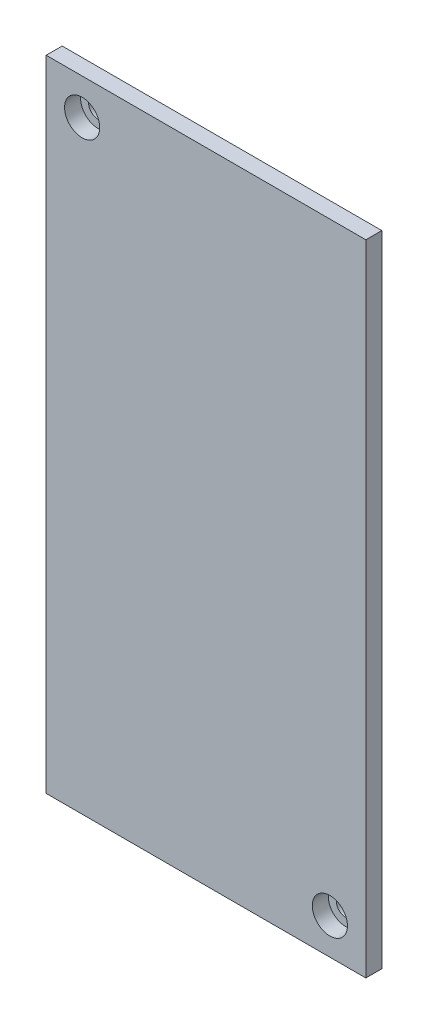
ISO-10303-21;
HEADER;
FILE_DESCRIPTION(('STEP AP214'),'2;1');
FILE_NAME('part.step','',(''),(''),'','','');
FILE_SCHEMA(('AUTOMOTIVE_DESIGN { 1 0 10303 214 1 1 1 1 }'));
ENDSEC;
DATA;
#1=APPLICATION_CONTEXT('core data for automotive mechanical design processes');
#2=APPLICATION_PROTOCOL_DEFINITION('international standard','automotive_design',2000,#1);
#3=PRODUCT_CONTEXT('',#1,'mechanical');
#4=PRODUCT('Part','Part','',(#3));
#5=PRODUCT_RELATED_PRODUCT_CATEGORY('part','',(#4));
#6=PRODUCT_DEFINITION_FORMATION('','',#4);
#7=PRODUCT_DEFINITION_CONTEXT('part definition',#1,'design');
#8=PRODUCT_DEFINITION('design','',#6,#7);
#9=PRODUCT_DEFINITION_SHAPE('','',#8);
#10=(LENGTH_UNIT() NAMED_UNIT(*) SI_UNIT(.MILLI.,.METRE.));
#11=(NAMED_UNIT(*) PLANE_ANGLE_UNIT() SI_UNIT($,.RADIAN.));
#12=(NAMED_UNIT(*) SI_UNIT($,.STERADIAN.) SOLID_ANGLE_UNIT());
#13=UNCERTAINTY_MEASURE_WITH_UNIT(LENGTH_MEASURE(1.E-05),#10,'distance_accuracy_value','');
#14=(GEOMETRIC_REPRESENTATION_CONTEXT(3) GLOBAL_UNCERTAINTY_ASSIGNED_CONTEXT((#13)) GLOBAL_UNIT_ASSIGNED_CONTEXT((#10,
#11,#12)) REPRESENTATION_CONTEXT('',''));
#15=CARTESIAN_POINT('',(0.,0.,0.));
#16=DIRECTION('',(0.,0.,1.));
#17=DIRECTION('',(1.,0.,0.));
#18=AXIS2_PLACEMENT_3D('',#15,#16,#17);
#19=CARTESIAN_POINT('',(15.5,-35.5,-1.));
#20=DIRECTION('',(0.,0.,1.));
#21=DIRECTION('',(1.,0.,0.));
#22=AXIS2_PLACEMENT_3D('',#19,#20,#21);
#23=CYLINDRICAL_SURFACE('',#22,1.2);
#24=CARTESIAN_POINT('',(15.5,-35.5,-1.));
#25=DIRECTION('',(0.,0.,1.));
#26=DIRECTION('',(1.,0.,0.));
#27=AXIS2_PLACEMENT_3D('',#24,#25,#26);
#28=CIRCLE('',#27,1.2);
#29=CARTESIAN_POINT('',(16.7,-35.5,-1.));
#30=VERTEX_POINT('',#29);
#31=EDGE_CURVE('E122',#30,#30,#28,.T.);
#32=ORIENTED_EDGE('',*,*,#31,.F.);
#33=EDGE_LOOP('',(#32));
#34=FACE_BOUND('',#33,.T.);
#35=CARTESIAN_POINT('',(15.5,-35.5,0.));
#36=DIRECTION('',(0.,0.,1.));
#37=DIRECTION('',(1.,0.,0.));
#38=AXIS2_PLACEMENT_3D('',#35,#36,#37);
#39=CIRCLE('',#38,1.2);
#40=CARTESIAN_POINT('',(16.7,-35.5,0.));
#41=VERTEX_POINT('',#40);
#42=EDGE_CURVE('E297',#41,#41,#39,.T.);
#43=ORIENTED_EDGE('',*,*,#42,.T.);
#44=EDGE_LOOP('',(#43));
#45=FACE_BOUND('',#44,.T.);
#46=ADVANCED_FACE('F33',(#34,#45),#23,.F.);
#47=CARTESIAN_POINT('',(-15.5,35.5,-1.));
#48=DIRECTION('',(0.,0.,1.));
#49=DIRECTION('',(1.,0.,0.));
#50=AXIS2_PLACEMENT_3D('',#47,#48,#49);
#51=CYLINDRICAL_SURFACE('',#50,1.2);
#52=CARTESIAN_POINT('',(-15.5,35.5,-1.));
#53=DIRECTION('',(0.,0.,1.));
#54=DIRECTION('',(1.,0.,0.));
#55=AXIS2_PLACEMENT_3D('',#52,#53,#54);
#56=CIRCLE('',#55,1.2);
#57=CARTESIAN_POINT('',(-14.3,35.5,-1.));
#58=VERTEX_POINT('',#57);
#59=EDGE_CURVE('E128',#58,#58,#56,.T.);
#60=ORIENTED_EDGE('',*,*,#59,.F.);
#61=EDGE_LOOP('',(#60));
#62=FACE_BOUND('',#61,.T.);
#63=CARTESIAN_POINT('',(-15.5,35.5,0.));
#64=DIRECTION('',(0.,0.,1.));
#65=DIRECTION('',(1.,0.,0.));
#66=AXIS2_PLACEMENT_3D('',#63,#64,#65);
#67=CIRCLE('',#66,1.2);
#68=CARTESIAN_POINT('',(-14.3,35.5,0.));
#69=VERTEX_POINT('',#68);
#70=EDGE_CURVE('E301',#69,#69,#67,.T.);
#71=ORIENTED_EDGE('',*,*,#70,.T.);
#72=EDGE_LOOP('',(#71));
#73=FACE_BOUND('',#72,.T.);
#74=ADVANCED_FACE('F198',(#62,#73),#51,.F.);
#75=CARTESIAN_POINT('',(20.,0.,2.));
#76=DIRECTION('',(1.,0.,0.));
#77=DIRECTION('',(0.,0.,-1.));
#78=AXIS2_PLACEMENT_3D('',#75,#76,#77);
#79=PLANE('',#78);
#80=DIRECTION('',(0.,-1.,0.));
#81=VECTOR('',#80,1.);
#82=CARTESIAN_POINT('',(20.,0.,0.));
#83=LINE('',#82,#81);
#84=CARTESIAN_POINT('',(20.,40.,0.));
#85=VERTEX_POINT('',#84);
#86=CARTESIAN_POINT('',(20.,-40.,0.));
#87=VERTEX_POINT('',#86);
#88=EDGE_CURVE('E133',#85,#87,#83,.T.);
#89=ORIENTED_EDGE('',*,*,#88,.F.);
#90=DIRECTION('',(0.,0.,-1.));
#91=VECTOR('',#90,1.);
#92=CARTESIAN_POINT('',(20.,40.,2.));
#93=LINE('',#92,#91);
#94=CARTESIAN_POINT('',(20.,40.,2.));
#95=VERTEX_POINT('',#94);
#96=EDGE_CURVE('E11',#95,#85,#93,.T.);
#97=ORIENTED_EDGE('',*,*,#96,.F.);
#98=DIRECTION('',(0.,-1.,0.));
#99=VECTOR('',#98,1.);
#100=CARTESIAN_POINT('',(20.,0.,2.));
#101=LINE('',#100,#99);
#102=CARTESIAN_POINT('',(20.,-40.,2.));
#103=VERTEX_POINT('',#102);
#104=EDGE_CURVE('E138',#95,#103,#101,.T.);
#105=ORIENTED_EDGE('',*,*,#104,.T.);
#106=DIRECTION('',(0.,0.,-1.));
#107=VECTOR('',#106,1.);
#108=CARTESIAN_POINT('',(20.,-40.,2.));
#109=LINE('',#108,#107);
#110=EDGE_CURVE('E149',#103,#87,#109,.T.);
#111=ORIENTED_EDGE('',*,*,#110,.T.);
#112=EDGE_LOOP('',(#89,#97,#105,#111));
#113=FACE_BOUND('',#112,.T.);
#114=ADVANCED_FACE('F35',(#113),#79,.T.);
#115=CARTESIAN_POINT('',(0.,40.,2.));
#116=DIRECTION('',(0.,1.,0.));
#117=DIRECTION('',(0.,0.,1.));
#118=AXIS2_PLACEMENT_3D('',#115,#116,#117);
#119=PLANE('',#118);
#120=DIRECTION('',(1.,0.,0.));
#121=VECTOR('',#120,1.);
#122=CARTESIAN_POINT('',(0.,40.,0.));
#123=LINE('',#122,#121);
#124=CARTESIAN_POINT('',(-20.,40.,0.));
#125=VERTEX_POINT('',#124);
#126=EDGE_CURVE('E152',#125,#85,#123,.T.);
#127=ORIENTED_EDGE('',*,*,#126,.F.);
#128=DIRECTION('',(0.,0.,-1.));
#129=VECTOR('',#128,1.);
#130=CARTESIAN_POINT('',(-20.,40.,2.));
#131=LINE('',#130,#129);
#132=CARTESIAN_POINT('',(-20.,40.,2.));
#133=VERTEX_POINT('',#132);
#134=EDGE_CURVE('E41',#133,#125,#131,.T.);
#135=ORIENTED_EDGE('',*,*,#134,.F.);
#136=DIRECTION('',(1.,0.,0.));
#137=VECTOR('',#136,1.);
#138=CARTESIAN_POINT('',(0.,40.,2.));
#139=LINE('',#138,#137);
#140=EDGE_CURVE('E141',#133,#95,#139,.T.);
#141=ORIENTED_EDGE('',*,*,#140,.T.);
#142=ORIENTED_EDGE('',*,*,#96,.T.);
#143=EDGE_LOOP('',(#127,#135,#141,#142));
#144=FACE_BOUND('',#143,.T.);
#145=ADVANCED_FACE('F173',(#144),#119,.T.);
#146=CARTESIAN_POINT('',(-20.,0.,2.));
#147=DIRECTION('',(1.,0.,0.));
#148=DIRECTION('',(0.,0.,-1.));
#149=AXIS2_PLACEMENT_3D('',#146,#147,#148);
#150=PLANE('',#149);
#151=DIRECTION('',(0.,-1.,0.));
#152=VECTOR('',#151,1.);
#153=CARTESIAN_POINT('',(-20.,0.,0.));
#154=LINE('',#153,#152);
#155=CARTESIAN_POINT('',(-20.,-40.,0.));
#156=VERTEX_POINT('',#155);
#157=EDGE_CURVE('E155',#125,#156,#154,.T.);
#158=ORIENTED_EDGE('',*,*,#157,.T.);
#159=DIRECTION('',(0.,0.,-1.));
#160=VECTOR('',#159,1.);
#161=CARTESIAN_POINT('',(-20.,-40.,2.));
#162=LINE('',#161,#160);
#163=CARTESIAN_POINT('',(-20.,-40.,2.));
#164=VERTEX_POINT('',#163);
#165=EDGE_CURVE('E160',#164,#156,#162,.T.);
#166=ORIENTED_EDGE('',*,*,#165,.F.);
#167=DIRECTION('',(0.,-1.,0.));
#168=VECTOR('',#167,1.);
#169=CARTESIAN_POINT('',(-20.,0.,2.));
#170=LINE('',#169,#168);
#171=EDGE_CURVE('E145',#133,#164,#170,.T.);
#172=ORIENTED_EDGE('',*,*,#171,.F.);
#173=ORIENTED_EDGE('',*,*,#134,.T.);
#174=EDGE_LOOP('',(#158,#166,#172,#173));
#175=FACE_BOUND('',#174,.T.);
#176=ADVANCED_FACE('F165',(#175),#150,.F.);
#177=CARTESIAN_POINT('',(0.,-40.,2.));
#178=DIRECTION('',(0.,1.,0.));
#179=DIRECTION('',(0.,0.,1.));
#180=AXIS2_PLACEMENT_3D('',#177,#178,#179);
#181=PLANE('',#180);
#182=DIRECTION('',(1.,0.,0.));
#183=VECTOR('',#182,1.);
#184=CARTESIAN_POINT('',(0.,-40.,0.));
#185=LINE('',#184,#183);
#186=EDGE_CURVE('E142',#156,#87,#185,.T.);
#187=ORIENTED_EDGE('',*,*,#186,.T.);
#188=ORIENTED_EDGE('',*,*,#110,.F.);
#189=DIRECTION('',(1.,0.,0.));
#190=VECTOR('',#189,1.);
#191=CARTESIAN_POINT('',(0.,-40.,2.));
#192=LINE('',#191,#190);
#193=EDGE_CURVE('E147',#164,#103,#192,.T.);
#194=ORIENTED_EDGE('',*,*,#193,.F.);
#195=ORIENTED_EDGE('',*,*,#165,.T.);
#196=EDGE_LOOP('',(#187,#188,#194,#195));
#197=FACE_BOUND('',#196,.T.);
#198=ADVANCED_FACE('F180',(#197),#181,.F.);
#199=CARTESIAN_POINT('',(0.,0.,2.));
#200=DIRECTION('',(0.,0.,1.));
#201=DIRECTION('',(1.,0.,0.));
#202=AXIS2_PLACEMENT_3D('',#199,#200,#201);
#203=PLANE('',#202);
#204=CARTESIAN_POINT('',(-15.5,35.5,2.));
#205=DIRECTION('',(0.,0.,1.));
#206=DIRECTION('',(1.,0.,0.));
#207=AXIS2_PLACEMENT_3D('',#204,#205,#206);
#208=CIRCLE('',#207,2.2);
#209=CARTESIAN_POINT('',(-13.3,35.5,2.));
#210=VERTEX_POINT('',#209);
#211=EDGE_CURVE('E305',#210,#210,#208,.T.);
#212=ORIENTED_EDGE('',*,*,#211,.F.);
#213=EDGE_LOOP('',(#212));
#214=FACE_BOUND('',#213,.T.);
#215=CARTESIAN_POINT('',(15.5,-35.5,2.));
#216=DIRECTION('',(0.,0.,1.));
#217=DIRECTION('',(1.,0.,0.));
#218=AXIS2_PLACEMENT_3D('',#215,#216,#217);
#219=CIRCLE('',#218,2.2);
#220=CARTESIAN_POINT('',(17.7,-35.5,2.));
#221=VERTEX_POINT('',#220);
#222=EDGE_CURVE('E302',#221,#221,#219,.T.);
#223=ORIENTED_EDGE('',*,*,#222,.F.);
#224=EDGE_LOOP('',(#223));
#225=FACE_BOUND('',#224,.T.);
#226=ORIENTED_EDGE('',*,*,#104,.F.);
#227=ORIENTED_EDGE('',*,*,#140,.F.);
#228=ORIENTED_EDGE('',*,*,#171,.T.);
#229=ORIENTED_EDGE('',*,*,#193,.T.);
#230=EDGE_LOOP('',(#226,#227,#228,#229));
#231=FACE_BOUND('',#230,.T.);
#232=ADVANCED_FACE('F182',(#214,#225,#231),#203,.T.);
#233=CARTESIAN_POINT('',(0.,0.,0.));
#234=DIRECTION('',(0.,0.,1.));
#235=DIRECTION('',(1.,0.,0.));
#236=AXIS2_PLACEMENT_3D('',#233,#234,#235);
#237=PLANE('',#236);
#238=DIRECTION('',(0.,1.,0.));
#239=VECTOR('',#238,1.);
#240=CARTESIAN_POINT('',(-17.8,0.,0.));
#241=LINE('',#240,#239);
#242=CARTESIAN_POINT('',(-17.8,-37.8,0.));
#243=VERTEX_POINT('',#242);
#244=CARTESIAN_POINT('',(-17.8,37.8,0.));
#245=VERTEX_POINT('',#244);
#246=EDGE_CURVE('E116',#243,#245,#241,.T.);
#247=ORIENTED_EDGE('',*,*,#246,.F.);
#248=DIRECTION('',(1.,0.,0.));
#249=VECTOR('',#248,1.);
#250=CARTESIAN_POINT('',(0.,-37.8,0.));
#251=LINE('',#250,#249);
#252=CARTESIAN_POINT('',(17.8,-37.8,0.));
#253=VERTEX_POINT('',#252);
#254=EDGE_CURVE('E48',#243,#253,#251,.T.);
#255=ORIENTED_EDGE('',*,*,#254,.T.);
#256=DIRECTION('',(0.,1.,0.));
#257=VECTOR('',#256,1.);
#258=CARTESIAN_POINT('',(17.8,0.,0.));
#259=LINE('',#258,#257);
#260=CARTESIAN_POINT('',(17.8,37.8,0.));
#261=VERTEX_POINT('',#260);
#262=EDGE_CURVE('E53',#253,#261,#259,.T.);
#263=ORIENTED_EDGE('',*,*,#262,.T.);
#264=DIRECTION('',(1.,0.,0.));
#265=VECTOR('',#264,1.);
#266=CARTESIAN_POINT('',(0.,37.8,0.));
#267=LINE('',#266,#265);
#268=EDGE_CURVE('E119',#245,#261,#267,.T.);
#269=ORIENTED_EDGE('',*,*,#268,.F.);
#270=EDGE_LOOP('',(#247,#255,#263,#269));
#271=FACE_BOUND('',#270,.T.);
#272=ORIENTED_EDGE('',*,*,#88,.T.);
#273=ORIENTED_EDGE('',*,*,#186,.F.);
#274=ORIENTED_EDGE('',*,*,#157,.F.);
#275=ORIENTED_EDGE('',*,*,#126,.T.);
#276=EDGE_LOOP('',(#272,#273,#274,#275));
#277=FACE_BOUND('',#276,.T.);
#278=ADVANCED_FACE('F172',(#271,#277),#237,.F.);
#279=CARTESIAN_POINT('',(0.,-37.8,-1.));
#280=DIRECTION('',(0.,-1.,0.));
#281=DIRECTION('',(0.,0.,-1.));
#282=AXIS2_PLACEMENT_3D('',#279,#280,#281);
#283=PLANE('',#282);
#284=ORIENTED_EDGE('',*,*,#254,.F.);
#285=DIRECTION('',(0.,0.,1.));
#286=VECTOR('',#285,1.);
#287=CARTESIAN_POINT('',(-17.8,-37.8,-1.));
#288=LINE('',#287,#286);
#289=CARTESIAN_POINT('',(-17.8,-37.8,-1.));
#290=VERTEX_POINT('',#289);
#291=EDGE_CURVE('E114',#290,#243,#288,.T.);
#292=ORIENTED_EDGE('',*,*,#291,.F.);
#293=DIRECTION('',(1.,0.,0.));
#294=VECTOR('',#293,1.);
#295=CARTESIAN_POINT('',(0.,-37.8,-1.));
#296=LINE('',#295,#294);
#297=CARTESIAN_POINT('',(17.8,-37.8,-1.));
#298=VERTEX_POINT('',#297);
#299=EDGE_CURVE('E107',#290,#298,#296,.T.);
#300=ORIENTED_EDGE('',*,*,#299,.T.);
#301=DIRECTION('',(0.,0.,1.));
#302=VECTOR('',#301,1.);
#303=CARTESIAN_POINT('',(17.8,-37.8,-1.));
#304=LINE('',#303,#302);
#305=EDGE_CURVE('E95',#298,#253,#304,.T.);
#306=ORIENTED_EDGE('',*,*,#305,.T.);
#307=EDGE_LOOP('',(#284,#292,#300,#306));
#308=FACE_BOUND('',#307,.T.);
#309=ADVANCED_FACE('F112',(#308),#283,.T.);
#310=CARTESIAN_POINT('',(-17.8,0.,-1.));
#311=DIRECTION('',(1.,0.,0.));
#312=DIRECTION('',(0.,0.,-1.));
#313=AXIS2_PLACEMENT_3D('',#310,#311,#312);
#314=PLANE('',#313);
#315=ORIENTED_EDGE('',*,*,#246,.T.);
#316=DIRECTION('',(0.,0.,1.));
#317=VECTOR('',#316,1.);
#318=CARTESIAN_POINT('',(-17.8,37.8,-1.));
#319=LINE('',#318,#317);
#320=CARTESIAN_POINT('',(-17.8,37.8,-1.));
#321=VERTEX_POINT('',#320);
#322=EDGE_CURVE('E134',#321,#245,#319,.T.);
#323=ORIENTED_EDGE('',*,*,#322,.F.);
#324=DIRECTION('',(0.,1.,0.));
#325=VECTOR('',#324,1.);
#326=CARTESIAN_POINT('',(-17.8,0.,-1.));
#327=LINE('',#326,#325);
#328=EDGE_CURVE('E102',#290,#321,#327,.T.);
#329=ORIENTED_EDGE('',*,*,#328,.F.);
#330=ORIENTED_EDGE('',*,*,#291,.T.);
#331=EDGE_LOOP('',(#315,#323,#329,#330));
#332=FACE_BOUND('',#331,.T.);
#333=ADVANCED_FACE('F215',(#332),#314,.F.);
#334=CARTESIAN_POINT('',(0.,37.8,-1.));
#335=DIRECTION('',(0.,-1.,0.));
#336=DIRECTION('',(0.,0.,-1.));
#337=AXIS2_PLACEMENT_3D('',#334,#335,#336);
#338=PLANE('',#337);
#339=ORIENTED_EDGE('',*,*,#268,.T.);
#340=DIRECTION('',(0.,0.,1.));
#341=VECTOR('',#340,1.);
#342=CARTESIAN_POINT('',(17.8,37.8,-1.));
#343=LINE('',#342,#341);
#344=CARTESIAN_POINT('',(17.8,37.8,-1.));
#345=VERTEX_POINT('',#344);
#346=EDGE_CURVE('E101',#345,#261,#343,.T.);
#347=ORIENTED_EDGE('',*,*,#346,.F.);
#348=DIRECTION('',(1.,0.,0.));
#349=VECTOR('',#348,1.);
#350=CARTESIAN_POINT('',(0.,37.8,-1.));
#351=LINE('',#350,#349);
#352=EDGE_CURVE('E109',#321,#345,#351,.T.);
#353=ORIENTED_EDGE('',*,*,#352,.F.);
#354=ORIENTED_EDGE('',*,*,#322,.T.);
#355=EDGE_LOOP('',(#339,#347,#353,#354));
#356=FACE_BOUND('',#355,.T.);
#357=ADVANCED_FACE('F218',(#356),#338,.F.);
#358=CARTESIAN_POINT('',(17.8,0.,-1.));
#359=DIRECTION('',(1.,0.,0.));
#360=DIRECTION('',(0.,0.,-1.));
#361=AXIS2_PLACEMENT_3D('',#358,#359,#360);
#362=PLANE('',#361);
#363=ORIENTED_EDGE('',*,*,#262,.F.);
#364=ORIENTED_EDGE('',*,*,#305,.F.);
#365=DIRECTION('',(0.,1.,0.));
#366=VECTOR('',#365,1.);
#367=CARTESIAN_POINT('',(17.8,0.,-1.));
#368=LINE('',#367,#366);
#369=EDGE_CURVE('E98',#298,#345,#368,.T.);
#370=ORIENTED_EDGE('',*,*,#369,.T.);
#371=ORIENTED_EDGE('',*,*,#346,.T.);
#372=EDGE_LOOP('',(#363,#364,#370,#371));
#373=FACE_BOUND('',#372,.T.);
#374=ADVANCED_FACE('F97',(#373),#362,.T.);
#375=CARTESIAN_POINT('',(0.,0.,-1.));
#376=DIRECTION('',(0.,0.,1.));
#377=DIRECTION('',(1.,0.,0.));
#378=AXIS2_PLACEMENT_3D('',#375,#376,#377);
#379=PLANE('',#378);
#380=ORIENTED_EDGE('',*,*,#59,.T.);
#381=EDGE_LOOP('',(#380));
#382=FACE_BOUND('',#381,.T.);
#383=ORIENTED_EDGE('',*,*,#31,.T.);
#384=EDGE_LOOP('',(#383));
#385=FACE_BOUND('',#384,.T.);
#386=ORIENTED_EDGE('',*,*,#299,.F.);
#387=ORIENTED_EDGE('',*,*,#328,.T.);
#388=ORIENTED_EDGE('',*,*,#352,.T.);
#389=ORIENTED_EDGE('',*,*,#369,.F.);
#390=EDGE_LOOP('',(#386,#387,#388,#389));
#391=FACE_BOUND('',#390,.T.);
#392=ADVANCED_FACE('F106',(#382,#385,#391),#379,.F.);
#393=CARTESIAN_POINT('',(-15.5,35.5,0.));
#394=DIRECTION('',(0.,0.,1.));
#395=DIRECTION('',(1.,0.,0.));
#396=AXIS2_PLACEMENT_3D('',#393,#394,#395);
#397=CYLINDRICAL_SURFACE('',#396,2.2);
#398=CARTESIAN_POINT('',(-15.5,35.5,0.));
#399=DIRECTION('',(0.,0.,1.));
#400=DIRECTION('',(1.,0.,0.));
#401=AXIS2_PLACEMENT_3D('',#398,#399,#400);
#402=CIRCLE('',#401,2.2);
#403=CARTESIAN_POINT('',(-13.3,35.5,0.));
#404=VERTEX_POINT('',#403);
#405=EDGE_CURVE('E314',#404,#404,#402,.T.);
#406=ORIENTED_EDGE('',*,*,#405,.F.);
#407=EDGE_LOOP('',(#406));
#408=FACE_BOUND('',#407,.T.);
#409=ORIENTED_EDGE('',*,*,#211,.T.);
#410=EDGE_LOOP('',(#409));
#411=FACE_BOUND('',#410,.T.);
#412=ADVANCED_FACE('F213',(#408,#411),#397,.F.);
#413=CARTESIAN_POINT('',(-15.5,35.5,0.));
#414=DIRECTION('',(0.,0.,1.));
#415=DIRECTION('',(1.,0.,0.));
#416=AXIS2_PLACEMENT_3D('',#413,#414,#415);
#417=PLANE('',#416);
#418=ORIENTED_EDGE('',*,*,#70,.F.);
#419=EDGE_LOOP('',(#418));
#420=FACE_BOUND('',#419,.T.);
#421=ORIENTED_EDGE('',*,*,#405,.T.);
#422=EDGE_LOOP('',(#421));
#423=FACE_BOUND('',#422,.T.);
#424=ADVANCED_FACE('F261',(#420,#423),#417,.T.);
#425=CARTESIAN_POINT('',(15.5,-35.5,0.));
#426=DIRECTION('',(0.,0.,1.));
#427=DIRECTION('',(1.,0.,0.));
#428=AXIS2_PLACEMENT_3D('',#425,#426,#427);
#429=CYLINDRICAL_SURFACE('',#428,2.2);
#430=CARTESIAN_POINT('',(15.5,-35.5,0.));
#431=DIRECTION('',(0.,0.,1.));
#432=DIRECTION('',(1.,0.,0.));
#433=AXIS2_PLACEMENT_3D('',#430,#431,#432);
#434=CIRCLE('',#433,2.2);
#435=CARTESIAN_POINT('',(17.7,-35.5,0.));
#436=VERTEX_POINT('',#435);
#437=EDGE_CURVE('E300',#436,#436,#434,.T.);
#438=ORIENTED_EDGE('',*,*,#437,.F.);
#439=EDGE_LOOP('',(#438));
#440=FACE_BOUND('',#439,.T.);
#441=ORIENTED_EDGE('',*,*,#222,.T.);
#442=EDGE_LOOP('',(#441));
#443=FACE_BOUND('',#442,.T.);
#444=ADVANCED_FACE('F268',(#440,#443),#429,.F.);
#445=CARTESIAN_POINT('',(15.5,-35.5,0.));
#446=DIRECTION('',(0.,0.,1.));
#447=DIRECTION('',(1.,0.,0.));
#448=AXIS2_PLACEMENT_3D('',#445,#446,#447);
#449=PLANE('',#448);
#450=ORIENTED_EDGE('',*,*,#42,.F.);
#451=EDGE_LOOP('',(#450));
#452=FACE_BOUND('',#451,.T.);
#453=ORIENTED_EDGE('',*,*,#437,.T.);
#454=EDGE_LOOP('',(#453));
#455=FACE_BOUND('',#454,.T.);
#456=ADVANCED_FACE('F276',(#452,#455),#449,.T.);
#457=CLOSED_SHELL('',(#46,#74,#114,#145,#176,#198,#232,#278,#309,#333,#357,#374,#392,#412,#424,
#444,#456));
#458=MANIFOLD_SOLID_BREP('B2',#457);
#459=ADVANCED_BREP_SHAPE_REPRESENTATION('',(#18,#458),#14);
#460=SHAPE_DEFINITION_REPRESENTATION(#9,#459);
ENDSEC;
END-ISO-10303-21;
